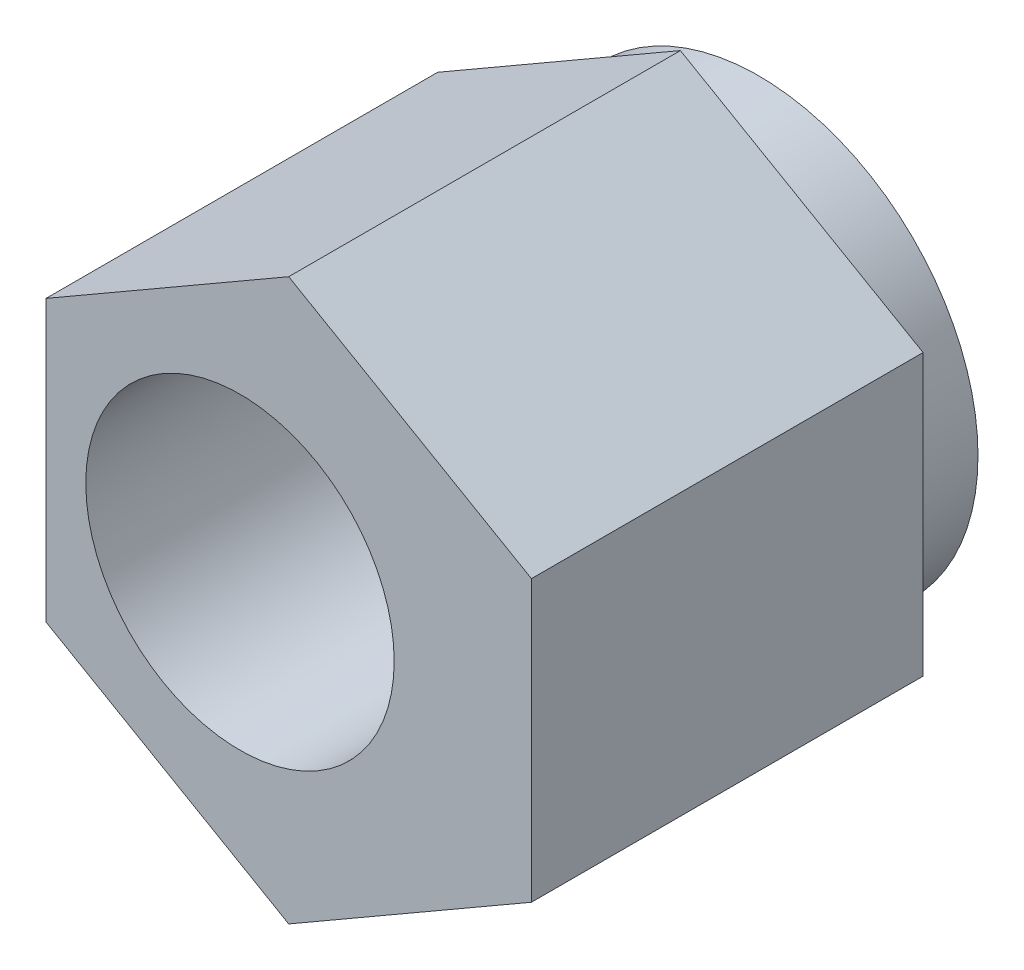
ISO-10303-21;
HEADER;
FILE_DESCRIPTION(('STEP AP214'),'2;1');
FILE_NAME('part.step','',(''),(''),'','','');
FILE_SCHEMA(('AUTOMOTIVE_DESIGN { 1 0 10303 214 1 1 1 1 }'));
ENDSEC;
DATA;
#1=APPLICATION_CONTEXT('core data for automotive mechanical design processes');
#2=APPLICATION_PROTOCOL_DEFINITION('international standard','automotive_design',2000,#1);
#3=PRODUCT_CONTEXT('',#1,'mechanical');
#4=PRODUCT('Part','Part','',(#3));
#5=PRODUCT_RELATED_PRODUCT_CATEGORY('part','',(#4));
#6=PRODUCT_DEFINITION_FORMATION('','',#4);
#7=PRODUCT_DEFINITION_CONTEXT('part definition',#1,'design');
#8=PRODUCT_DEFINITION('design','',#6,#7);
#9=PRODUCT_DEFINITION_SHAPE('','',#8);
#10=(LENGTH_UNIT() NAMED_UNIT(*) SI_UNIT(.MILLI.,.METRE.));
#11=(NAMED_UNIT(*) PLANE_ANGLE_UNIT() SI_UNIT($,.RADIAN.));
#12=(NAMED_UNIT(*) SI_UNIT($,.STERADIAN.) SOLID_ANGLE_UNIT());
#13=UNCERTAINTY_MEASURE_WITH_UNIT(LENGTH_MEASURE(1.E-05),#10,'distance_accuracy_value','');
#14=(GEOMETRIC_REPRESENTATION_CONTEXT(3) GLOBAL_UNCERTAINTY_ASSIGNED_CONTEXT((#13)) GLOBAL_UNIT_ASSIGNED_CONTEXT((#10,
#11,#12)) REPRESENTATION_CONTEXT('',''));
#15=CARTESIAN_POINT('',(0.,0.,0.));
#16=DIRECTION('',(0.,0.,1.));
#17=DIRECTION('',(1.,0.,0.));
#18=AXIS2_PLACEMENT_3D('',#15,#16,#17);
#19=CARTESIAN_POINT('',(4.725,0.,6.35));
#20=DIRECTION('',(-1.,0.,0.));
#21=DIRECTION('',(0.,-1.,0.));
#22=AXIS2_PLACEMENT_3D('',#19,#20,#21);
#23=PLANE('',#22);
#24=DIRECTION('',(0.,1.,0.));
#25=VECTOR('',#24,1.);
#26=CARTESIAN_POINT('',(4.725,0.,0.));
#27=LINE('',#26,#25);
#28=CARTESIAN_POINT('',(4.725,-2.27187330926118,0.));
#29=VERTEX_POINT('',#28);
#30=CARTESIAN_POINT('',(4.725,2.27187330926118,0.));
#31=VERTEX_POINT('',#30);
#32=EDGE_CURVE('E120',#29,#31,#27,.T.);
#33=ORIENTED_EDGE('',*,*,#32,.T.);
#34=DIRECTION('',(0.,0.,-1.));
#35=VECTOR('',#34,1.);
#36=CARTESIAN_POINT('',(4.725,2.27187330926118,6.35));
#37=LINE('',#36,#35);
#38=CARTESIAN_POINT('',(4.725,2.27187330926118,6.35));
#39=VERTEX_POINT('',#38);
#40=EDGE_CURVE('E11',#39,#31,#37,.T.);
#41=ORIENTED_EDGE('',*,*,#40,.F.);
#42=DIRECTION('',(0.,1.,0.));
#43=VECTOR('',#42,1.);
#44=CARTESIAN_POINT('',(4.725,0.,6.35));
#45=LINE('',#44,#43);
#46=CARTESIAN_POINT('',(4.725,-2.27187330926118,6.35));
#47=VERTEX_POINT('',#46);
#48=EDGE_CURVE('E131',#47,#39,#45,.T.);
#49=ORIENTED_EDGE('',*,*,#48,.F.);
#50=DIRECTION('',(0.,0.,-1.));
#51=VECTOR('',#50,1.);
#52=CARTESIAN_POINT('',(4.725,-2.27187330926118,6.35));
#53=LINE('',#52,#51);
#54=EDGE_CURVE('E119',#47,#29,#53,.T.);
#55=ORIENTED_EDGE('',*,*,#54,.T.);
#56=EDGE_LOOP('',(#33,#41,#49,#55));
#57=FACE_BOUND('',#56,.T.);
#58=ADVANCED_FACE('F32',(#57),#23,.F.);
#59=CARTESIAN_POINT('',(2.165,3.74988999838662,6.35));
#60=DIRECTION('',(-0.5,-0.866025403784439,0.));
#61=DIRECTION('',(0.866025403784439,-0.5,0.));
#62=AXIS2_PLACEMENT_3D('',#59,#60,#61);
#63=PLANE('',#62);
#64=DIRECTION('',(-0.866025403784439,0.5,0.));
#65=VECTOR('',#64,1.);
#66=CARTESIAN_POINT('',(2.165,3.74988999838662,0.));
#67=LINE('',#66,#65);
#68=CARTESIAN_POINT('',(0.789999999999998,4.54374661852235,0.));
#69=VERTEX_POINT('',#68);
#70=EDGE_CURVE('E123',#31,#69,#67,.T.);
#71=ORIENTED_EDGE('',*,*,#70,.T.);
#72=DIRECTION('',(0.,0.,-1.));
#73=VECTOR('',#72,1.);
#74=CARTESIAN_POINT('',(0.789999999999998,4.54374661852235,6.35));
#75=LINE('',#74,#73);
#76=CARTESIAN_POINT('',(0.789999999999998,4.54374661852235,6.35));
#77=VERTEX_POINT('',#76);
#78=EDGE_CURVE('E40',#77,#69,#75,.T.);
#79=ORIENTED_EDGE('',*,*,#78,.F.);
#80=DIRECTION('',(-0.866025403784439,0.5,0.));
#81=VECTOR('',#80,1.);
#82=CARTESIAN_POINT('',(2.165,3.74988999838662,6.35));
#83=LINE('',#82,#81);
#84=EDGE_CURVE('E85',#39,#77,#83,.T.);
#85=ORIENTED_EDGE('',*,*,#84,.F.);
#86=ORIENTED_EDGE('',*,*,#40,.T.);
#87=EDGE_LOOP('',(#71,#79,#85,#86));
#88=FACE_BOUND('',#87,.T.);
#89=ADVANCED_FACE('F156',(#88),#63,.F.);
#90=CARTESIAN_POINT('',(-1.77,3.06572992939691,6.35));
#91=DIRECTION('',(0.5,-0.866025403784439,0.));
#92=DIRECTION('',(0.866025403784439,0.5,0.));
#93=AXIS2_PLACEMENT_3D('',#90,#91,#92);
#94=PLANE('',#93);
#95=DIRECTION('',(-0.866025403784439,-0.5,0.));
#96=VECTOR('',#95,1.);
#97=CARTESIAN_POINT('',(-1.77,3.06572992939691,0.));
#98=LINE('',#97,#96);
#99=CARTESIAN_POINT('',(-3.145,2.27187330926118,0.));
#100=VERTEX_POINT('',#99);
#101=EDGE_CURVE('E126',#69,#100,#98,.T.);
#102=ORIENTED_EDGE('',*,*,#101,.T.);
#103=DIRECTION('',(0.,0.,-1.));
#104=VECTOR('',#103,1.);
#105=CARTESIAN_POINT('',(-3.145,2.27187330926118,6.35));
#106=LINE('',#105,#104);
#107=CARTESIAN_POINT('',(-3.145,2.27187330926118,6.35));
#108=VERTEX_POINT('',#107);
#109=EDGE_CURVE('E108',#108,#100,#106,.T.);
#110=ORIENTED_EDGE('',*,*,#109,.F.);
#111=DIRECTION('',(-0.866025403784439,-0.5,0.));
#112=VECTOR('',#111,1.);
#113=CARTESIAN_POINT('',(-1.77,3.06572992939691,6.35));
#114=LINE('',#113,#112);
#115=EDGE_CURVE('E99',#77,#108,#114,.T.);
#116=ORIENTED_EDGE('',*,*,#115,.F.);
#117=ORIENTED_EDGE('',*,*,#78,.T.);
#118=EDGE_LOOP('',(#102,#110,#116,#117));
#119=FACE_BOUND('',#118,.T.);
#120=ADVANCED_FACE('F137',(#119),#94,.F.);
#121=CARTESIAN_POINT('',(-3.145,0.,6.35));
#122=DIRECTION('',(1.,0.,0.));
#123=DIRECTION('',(0.,0.,-1.));
#124=AXIS2_PLACEMENT_3D('',#121,#122,#123);
#125=PLANE('',#124);
#126=DIRECTION('',(0.,-1.,0.));
#127=VECTOR('',#126,1.);
#128=CARTESIAN_POINT('',(-3.145,0.,0.));
#129=LINE('',#128,#127);
#130=CARTESIAN_POINT('',(-3.145,-2.27187330926118,0.));
#131=VERTEX_POINT('',#130);
#132=EDGE_CURVE('E107',#100,#131,#129,.T.);
#133=ORIENTED_EDGE('',*,*,#132,.T.);
#134=DIRECTION('',(0.,0.,-1.));
#135=VECTOR('',#134,1.);
#136=CARTESIAN_POINT('',(-3.145,-2.27187330926118,6.35));
#137=LINE('',#136,#135);
#138=CARTESIAN_POINT('',(-3.145,-2.27187330926118,6.35));
#139=VERTEX_POINT('',#138);
#140=EDGE_CURVE('E104',#139,#131,#137,.T.);
#141=ORIENTED_EDGE('',*,*,#140,.F.);
#142=DIRECTION('',(0.,-1.,0.));
#143=VECTOR('',#142,1.);
#144=CARTESIAN_POINT('',(-3.145,0.,6.35));
#145=LINE('',#144,#143);
#146=EDGE_CURVE('E92',#108,#139,#145,.T.);
#147=ORIENTED_EDGE('',*,*,#146,.F.);
#148=ORIENTED_EDGE('',*,*,#109,.T.);
#149=EDGE_LOOP('',(#133,#141,#147,#148));
#150=FACE_BOUND('',#149,.T.);
#151=ADVANCED_FACE('F105',(#150),#125,.F.);
#152=CARTESIAN_POINT('',(-1.77,-3.06572992939691,6.35));
#153=DIRECTION('',(0.5,0.866025403784439,0.));
#154=DIRECTION('',(-0.866025403784439,0.5,0.));
#155=AXIS2_PLACEMENT_3D('',#152,#153,#154);
#156=PLANE('',#155);
#157=DIRECTION('',(0.866025403784439,-0.5,0.));
#158=VECTOR('',#157,1.);
#159=CARTESIAN_POINT('',(-1.77,-3.06572992939691,0.));
#160=LINE('',#159,#158);
#161=CARTESIAN_POINT('',(0.789999999999999,-4.54374661852236,0.));
#162=VERTEX_POINT('',#161);
#163=EDGE_CURVE('E71',#131,#162,#160,.T.);
#164=ORIENTED_EDGE('',*,*,#163,.T.);
#165=DIRECTION('',(0.,0.,-1.));
#166=VECTOR('',#165,1.);
#167=CARTESIAN_POINT('',(0.789999999999999,-4.54374661852236,6.35));
#168=LINE('',#167,#166);
#169=CARTESIAN_POINT('',(0.789999999999999,-4.54374661852236,6.35));
#170=VERTEX_POINT('',#169);
#171=EDGE_CURVE('E109',#170,#162,#168,.T.);
#172=ORIENTED_EDGE('',*,*,#171,.F.);
#173=DIRECTION('',(0.866025403784439,-0.5,0.));
#174=VECTOR('',#173,1.);
#175=CARTESIAN_POINT('',(-1.77,-3.06572992939691,6.35));
#176=LINE('',#175,#174);
#177=EDGE_CURVE('E97',#139,#170,#176,.T.);
#178=ORIENTED_EDGE('',*,*,#177,.F.);
#179=ORIENTED_EDGE('',*,*,#140,.T.);
#180=EDGE_LOOP('',(#164,#172,#178,#179));
#181=FACE_BOUND('',#180,.T.);
#182=ADVANCED_FACE('F111',(#181),#156,.F.);
#183=CARTESIAN_POINT('',(2.165,-3.74988999838662,6.35));
#184=DIRECTION('',(-0.5,0.866025403784439,0.));
#185=DIRECTION('',(-0.866025403784439,-0.5,0.));
#186=AXIS2_PLACEMENT_3D('',#183,#184,#185);
#187=PLANE('',#186);
#188=DIRECTION('',(0.866025403784439,0.5,0.));
#189=VECTOR('',#188,1.);
#190=CARTESIAN_POINT('',(2.165,-3.74988999838662,0.));
#191=LINE('',#190,#189);
#192=EDGE_CURVE('E77',#162,#29,#191,.T.);
#193=ORIENTED_EDGE('',*,*,#192,.T.);
#194=ORIENTED_EDGE('',*,*,#54,.F.);
#195=DIRECTION('',(0.866025403784439,0.5,0.));
#196=VECTOR('',#195,1.);
#197=CARTESIAN_POINT('',(2.165,-3.74988999838662,6.35));
#198=LINE('',#197,#196);
#199=EDGE_CURVE('E48',#170,#47,#198,.T.);
#200=ORIENTED_EDGE('',*,*,#199,.F.);
#201=ORIENTED_EDGE('',*,*,#171,.T.);
#202=EDGE_LOOP('',(#193,#194,#200,#201));
#203=FACE_BOUND('',#202,.T.);
#204=ADVANCED_FACE('F144',(#203),#187,.F.);
#205=CARTESIAN_POINT('',(0.,0.,6.35));
#206=DIRECTION('',(0.,0.,-1.));
#207=DIRECTION('',(-1.,0.,0.));
#208=AXIS2_PLACEMENT_3D('',#205,#206,#207);
#209=CYLINDRICAL_SURFACE('',#208,2.5);
#210=CARTESIAN_POINT('',(0.,0.,6.35));
#211=DIRECTION('',(0.,0.,1.));
#212=DIRECTION('',(1.,0.,0.));
#213=AXIS2_PLACEMENT_3D('',#210,#211,#212);
#214=CIRCLE('',#213,2.5);
#215=CARTESIAN_POINT('',(2.5,0.,6.35));
#216=VERTEX_POINT('',#215);
#217=EDGE_CURVE('E113',#216,#216,#214,.T.);
#218=ORIENTED_EDGE('',*,*,#217,.T.);
#219=EDGE_LOOP('',(#218));
#220=FACE_BOUND('',#219,.T.);
#221=CARTESIAN_POINT('',(0.,0.,-1.27));
#222=DIRECTION('',(0.,0.,1.));
#223=DIRECTION('',(1.,0.,0.));
#224=AXIS2_PLACEMENT_3D('',#221,#222,#223);
#225=CIRCLE('',#224,2.5);
#226=CARTESIAN_POINT('',(2.5,0.,-1.27));
#227=VERTEX_POINT('',#226);
#228=EDGE_CURVE('E232',#227,#227,#225,.T.);
#229=ORIENTED_EDGE('',*,*,#228,.F.);
#230=EDGE_LOOP('',(#229));
#231=FACE_BOUND('',#230,.T.);
#232=ADVANCED_FACE('F146',(#220,#231),#209,.F.);
#233=CARTESIAN_POINT('',(0.,0.,6.35));
#234=DIRECTION('',(0.,0.,1.));
#235=DIRECTION('',(1.,0.,0.));
#236=AXIS2_PLACEMENT_3D('',#233,#234,#235);
#237=PLANE('',#236);
#238=ORIENTED_EDGE('',*,*,#48,.T.);
#239=ORIENTED_EDGE('',*,*,#84,.T.);
#240=ORIENTED_EDGE('',*,*,#115,.T.);
#241=ORIENTED_EDGE('',*,*,#146,.T.);
#242=ORIENTED_EDGE('',*,*,#177,.T.);
#243=ORIENTED_EDGE('',*,*,#199,.T.);
#244=EDGE_LOOP('',(#238,#239,#240,#241,#242,#243));
#245=FACE_BOUND('',#244,.T.);
#246=ORIENTED_EDGE('',*,*,#217,.F.);
#247=EDGE_LOOP('',(#246));
#248=FACE_BOUND('',#247,.T.);
#249=ADVANCED_FACE('F94',(#245,#248),#237,.T.);
#250=CARTESIAN_POINT('',(0.,0.,0.));
#251=DIRECTION('',(0.,0.,1.));
#252=DIRECTION('',(1.,0.,0.));
#253=AXIS2_PLACEMENT_3D('',#250,#251,#252);
#254=PLANE('',#253);
#255=CARTESIAN_POINT('',(0.79,0.,0.));
#256=DIRECTION('',(0.,0.,1.));
#257=DIRECTION('',(1.,0.,0.));
#258=AXIS2_PLACEMENT_3D('',#255,#256,#257);
#259=CIRCLE('',#258,3.555);
#260=CARTESIAN_POINT('',(4.345,0.,0.));
#261=VERTEX_POINT('',#260);
#262=EDGE_CURVE('E236',#261,#261,#259,.T.);
#263=ORIENTED_EDGE('',*,*,#262,.T.);
#264=EDGE_LOOP('',(#263));
#265=FACE_BOUND('',#264,.T.);
#266=ORIENTED_EDGE('',*,*,#32,.F.);
#267=ORIENTED_EDGE('',*,*,#192,.F.);
#268=ORIENTED_EDGE('',*,*,#163,.F.);
#269=ORIENTED_EDGE('',*,*,#132,.F.);
#270=ORIENTED_EDGE('',*,*,#101,.F.);
#271=ORIENTED_EDGE('',*,*,#70,.F.);
#272=EDGE_LOOP('',(#266,#267,#268,#269,#270,#271));
#273=FACE_BOUND('',#272,.T.);
#274=ADVANCED_FACE('F140',(#265,#273),#254,.F.);
#275=CARTESIAN_POINT('',(0.79,0.,-1.27));
#276=DIRECTION('',(0.,0.,1.));
#277=DIRECTION('',(1.,0.,0.));
#278=AXIS2_PLACEMENT_3D('',#275,#276,#277);
#279=CYLINDRICAL_SURFACE('',#278,3.555);
#280=CARTESIAN_POINT('',(0.79,0.,-1.27));
#281=DIRECTION('',(0.,0.,1.));
#282=DIRECTION('',(1.,0.,0.));
#283=AXIS2_PLACEMENT_3D('',#280,#281,#282);
#284=CIRCLE('',#283,3.555);
#285=CARTESIAN_POINT('',(4.345,0.,-1.27));
#286=VERTEX_POINT('',#285);
#287=EDGE_CURVE('E124',#286,#286,#284,.T.);
#288=ORIENTED_EDGE('',*,*,#287,.T.);
#289=EDGE_LOOP('',(#288));
#290=FACE_BOUND('',#289,.T.);
#291=ORIENTED_EDGE('',*,*,#262,.F.);
#292=EDGE_LOOP('',(#291));
#293=FACE_BOUND('',#292,.T.);
#294=ADVANCED_FACE('F205',(#290,#293),#279,.T.);
#295=CARTESIAN_POINT('',(0.,0.,-1.27));
#296=DIRECTION('',(0.,0.,1.));
#297=DIRECTION('',(1.,0.,0.));
#298=AXIS2_PLACEMENT_3D('',#295,#296,#297);
#299=PLANE('',#298);
#300=ORIENTED_EDGE('',*,*,#228,.T.);
#301=EDGE_LOOP('',(#300));
#302=FACE_BOUND('',#301,.T.);
#303=ORIENTED_EDGE('',*,*,#287,.F.);
#304=EDGE_LOOP('',(#303));
#305=FACE_BOUND('',#304,.T.);
#306=ADVANCED_FACE('F215',(#302,#305),#299,.F.);
#307=CLOSED_SHELL('',(#58,#89,#120,#151,#182,#204,#232,#249,#274,#294,#306));
#308=MANIFOLD_SOLID_BREP('B2',#307);
#309=ADVANCED_BREP_SHAPE_REPRESENTATION('',(#18,#308),#14);
#310=SHAPE_DEFINITION_REPRESENTATION(#9,#309);
ENDSEC;
END-ISO-10303-21;
